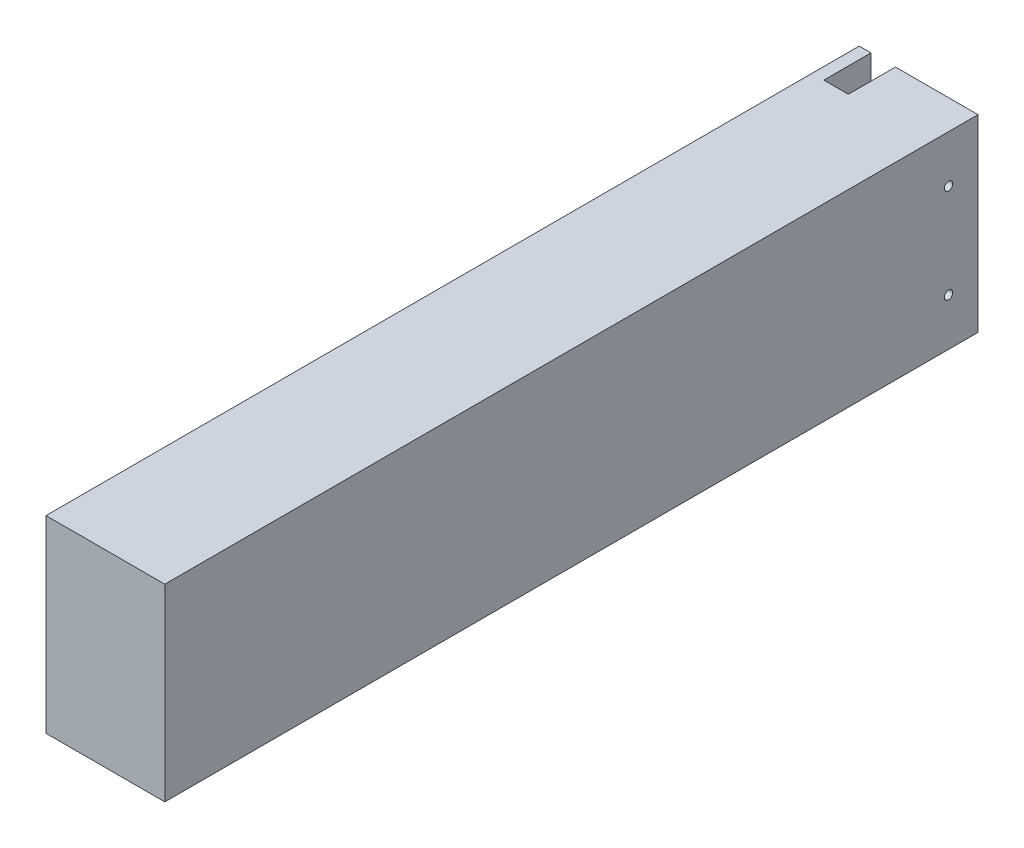
ISO-10303-21;
HEADER;
FILE_DESCRIPTION(('STEP AP214'),'2;1');
FILE_NAME('part.step','',(''),(''),'','','');
FILE_SCHEMA(('AUTOMOTIVE_DESIGN { 1 0 10303 214 1 1 1 1 }'));
ENDSEC;
DATA;
#1=APPLICATION_CONTEXT('core data for automotive mechanical design processes');
#2=APPLICATION_PROTOCOL_DEFINITION('international standard','automotive_design',2000,#1);
#3=PRODUCT_CONTEXT('',#1,'mechanical');
#4=PRODUCT('Part','Part','',(#3));
#5=PRODUCT_RELATED_PRODUCT_CATEGORY('part','',(#4));
#6=PRODUCT_DEFINITION_FORMATION('','',#4);
#7=PRODUCT_DEFINITION_CONTEXT('part definition',#1,'design');
#8=PRODUCT_DEFINITION('design','',#6,#7);
#9=PRODUCT_DEFINITION_SHAPE('','',#8);
#10=(LENGTH_UNIT() NAMED_UNIT(*) SI_UNIT(.MILLI.,.METRE.));
#11=(NAMED_UNIT(*) PLANE_ANGLE_UNIT() SI_UNIT($,.RADIAN.));
#12=(NAMED_UNIT(*) SI_UNIT($,.STERADIAN.) SOLID_ANGLE_UNIT());
#13=UNCERTAINTY_MEASURE_WITH_UNIT(LENGTH_MEASURE(1.E-05),#10,'distance_accuracy_value','');
#14=(GEOMETRIC_REPRESENTATION_CONTEXT(3) GLOBAL_UNCERTAINTY_ASSIGNED_CONTEXT((#13)) GLOBAL_UNIT_ASSIGNED_CONTEXT((#10,
#11,#12)) REPRESENTATION_CONTEXT('',''));
#15=CARTESIAN_POINT('',(0.,0.,0.));
#16=DIRECTION('',(0.,0.,1.));
#17=DIRECTION('',(1.,0.,0.));
#18=AXIS2_PLACEMENT_3D('',#15,#16,#17);
#19=CARTESIAN_POINT('',(12.954,50.8,-15.875));
#20=DIRECTION('',(0.,0.,1.));
#21=DIRECTION('',(1.,0.,0.));
#22=AXIS2_PLACEMENT_3D('',#19,#20,#21);
#23=PLANE('',#22);
#24=DIRECTION('',(-1.,0.,0.));
#25=VECTOR('',#24,1.);
#26=CARTESIAN_POINT('',(12.954,0.,-15.875));
#27=LINE('',#26,#25);
#28=CARTESIAN_POINT('',(32.004,0.,-15.875));
#29=VERTEX_POINT('',#28);
#30=CARTESIAN_POINT('',(9.779,0.,-15.875));
#31=VERTEX_POINT('',#30);
#32=EDGE_CURVE('E118',#29,#31,#27,.T.);
#33=ORIENTED_EDGE('',*,*,#32,.T.);
#34=DIRECTION('',(0.,-1.,0.));
#35=VECTOR('',#34,1.);
#36=CARTESIAN_POINT('',(9.779,50.8,-15.875));
#37=LINE('',#36,#35);
#38=CARTESIAN_POINT('',(9.779,50.8,-15.875));
#39=VERTEX_POINT('',#38);
#40=EDGE_CURVE('E11',#39,#31,#37,.T.);
#41=ORIENTED_EDGE('',*,*,#40,.F.);
#42=DIRECTION('',(-1.,0.,0.));
#43=VECTOR('',#42,1.);
#44=CARTESIAN_POINT('',(12.954,50.8,-15.875));
#45=LINE('',#44,#43);
#46=CARTESIAN_POINT('',(32.004,50.8,-15.875));
#47=VERTEX_POINT('',#46);
#48=EDGE_CURVE('E86',#47,#39,#45,.T.);
#49=ORIENTED_EDGE('',*,*,#48,.F.);
#50=DIRECTION('',(0.,1.,0.));
#51=VECTOR('',#50,1.);
#52=CARTESIAN_POINT('',(32.004,0.,-15.875));
#53=LINE('',#52,#51);
#54=EDGE_CURVE('E160',#29,#47,#53,.T.);
#55=ORIENTED_EDGE('',*,*,#54,.F.);
#56=EDGE_LOOP('',(#33,#41,#49,#55));
#57=FACE_BOUND('',#56,.T.);
#58=ADVANCED_FACE('F35',(#57),#23,.F.);
#59=CARTESIAN_POINT('',(9.779,50.8,-15.875));
#60=DIRECTION('',(1.,0.,0.));
#61=DIRECTION('',(0.,0.,-1.));
#62=AXIS2_PLACEMENT_3D('',#59,#60,#61);
#63=PLANE('',#62);
#64=CARTESIAN_POINT('',(9.779,12.7,-7.9375));
#65=DIRECTION('',(1.,0.,0.));
#66=DIRECTION('',(0.,0.,-1.));
#67=AXIS2_PLACEMENT_3D('',#64,#65,#66);
#68=CIRCLE('',#67,1.1303);
#69=CARTESIAN_POINT('',(9.779,12.7,-9.0678));
#70=VERTEX_POINT('',#69);
#71=EDGE_CURVE('E178',#70,#70,#68,.F.);
#72=ORIENTED_EDGE('',*,*,#71,.F.);
#73=EDGE_LOOP('',(#72));
#74=FACE_BOUND('',#73,.T.);
#75=CARTESIAN_POINT('',(9.779,38.1,-7.9375));
#76=DIRECTION('',(1.,0.,0.));
#77=DIRECTION('',(0.,0.,-1.));
#78=AXIS2_PLACEMENT_3D('',#75,#76,#77);
#79=CIRCLE('',#78,1.1303);
#80=CARTESIAN_POINT('',(9.779,38.1,-9.0678));
#81=VERTEX_POINT('',#80);
#82=EDGE_CURVE('E174',#81,#81,#79,.F.);
#83=ORIENTED_EDGE('',*,*,#82,.F.);
#84=EDGE_LOOP('',(#83));
#85=FACE_BOUND('',#84,.T.);
#86=DIRECTION('',(0.,0.,1.));
#87=VECTOR('',#86,1.);
#88=CARTESIAN_POINT('',(9.779,0.,-15.875));
#89=LINE('',#88,#87);
#90=CARTESIAN_POINT('',(9.779,0.,-3.175));
#91=VERTEX_POINT('',#90);
#92=EDGE_CURVE('E120',#31,#91,#89,.T.);
#93=ORIENTED_EDGE('',*,*,#92,.T.);
#94=DIRECTION('',(0.,-1.,0.));
#95=VECTOR('',#94,1.);
#96=CARTESIAN_POINT('',(9.779,50.8,-3.175));
#97=LINE('',#96,#95);
#98=CARTESIAN_POINT('',(9.779,50.8,-3.175));
#99=VERTEX_POINT('',#98);
#100=EDGE_CURVE('E43',#99,#91,#97,.T.);
#101=ORIENTED_EDGE('',*,*,#100,.F.);
#102=DIRECTION('',(0.,0.,1.));
#103=VECTOR('',#102,1.);
#104=CARTESIAN_POINT('',(9.779,50.8,-15.875));
#105=LINE('',#104,#103);
#106=EDGE_CURVE('E99',#39,#99,#105,.T.);
#107=ORIENTED_EDGE('',*,*,#106,.F.);
#108=ORIENTED_EDGE('',*,*,#40,.T.);
#109=EDGE_LOOP('',(#93,#101,#107,#108));
#110=FACE_BOUND('',#109,.T.);
#111=ADVANCED_FACE('F202',(#74,#85,#110),#63,.F.);
#112=CARTESIAN_POINT('',(9.779,50.8,-3.175));
#113=DIRECTION('',(0.,0.,1.));
#114=DIRECTION('',(1.,0.,0.));
#115=AXIS2_PLACEMENT_3D('',#112,#113,#114);
#116=PLANE('',#115);
#117=DIRECTION('',(-1.,0.,0.));
#118=VECTOR('',#117,1.);
#119=CARTESIAN_POINT('',(9.779,0.,-3.175));
#120=LINE('',#119,#118);
#121=CARTESIAN_POINT('',(3.175,0.,-3.175));
#122=VERTEX_POINT('',#121);
#123=EDGE_CURVE('E107',#91,#122,#120,.T.);
#124=ORIENTED_EDGE('',*,*,#123,.T.);
#125=DIRECTION('',(0.,-1.,0.));
#126=VECTOR('',#125,1.);
#127=CARTESIAN_POINT('',(3.175,50.8,-3.175));
#128=LINE('',#127,#126);
#129=CARTESIAN_POINT('',(3.175,50.8,-3.175));
#130=VERTEX_POINT('',#129);
#131=EDGE_CURVE('E104',#130,#122,#128,.T.);
#132=ORIENTED_EDGE('',*,*,#131,.F.);
#133=DIRECTION('',(-1.,0.,0.));
#134=VECTOR('',#133,1.);
#135=CARTESIAN_POINT('',(9.779,50.8,-3.175));
#136=LINE('',#135,#134);
#137=EDGE_CURVE('E93',#99,#130,#136,.T.);
#138=ORIENTED_EDGE('',*,*,#137,.F.);
#139=ORIENTED_EDGE('',*,*,#100,.T.);
#140=EDGE_LOOP('',(#124,#132,#138,#139));
#141=FACE_BOUND('',#140,.T.);
#142=ADVANCED_FACE('F105',(#141),#116,.F.);
#143=CARTESIAN_POINT('',(3.175,50.8,-15.875));
#144=DIRECTION('',(-1.,0.,0.));
#145=DIRECTION('',(0.,0.,1.));
#146=AXIS2_PLACEMENT_3D('',#143,#144,#145);
#147=PLANE('',#146);
#148=DIRECTION('',(0.,0.,-1.));
#149=VECTOR('',#148,1.);
#150=CARTESIAN_POINT('',(3.175,0.,-15.875));
#151=LINE('',#150,#149);
#152=CARTESIAN_POINT('',(3.175,0.,-15.875));
#153=VERTEX_POINT('',#152);
#154=EDGE_CURVE('E72',#122,#153,#151,.T.);
#155=ORIENTED_EDGE('',*,*,#154,.T.);
#156=DIRECTION('',(0.,-1.,0.));
#157=VECTOR('',#156,1.);
#158=CARTESIAN_POINT('',(3.175,50.8,-15.875));
#159=LINE('',#158,#157);
#160=CARTESIAN_POINT('',(3.175,50.8,-15.875));
#161=VERTEX_POINT('',#160);
#162=EDGE_CURVE('E108',#161,#153,#159,.T.);
#163=ORIENTED_EDGE('',*,*,#162,.F.);
#164=DIRECTION('',(0.,0.,-1.));
#165=VECTOR('',#164,1.);
#166=CARTESIAN_POINT('',(3.175,50.8,-15.875));
#167=LINE('',#166,#165);
#168=EDGE_CURVE('E97',#130,#161,#167,.T.);
#169=ORIENTED_EDGE('',*,*,#168,.F.);
#170=ORIENTED_EDGE('',*,*,#131,.T.);
#171=EDGE_LOOP('',(#155,#163,#169,#170));
#172=FACE_BOUND('',#171,.T.);
#173=ADVANCED_FACE('F110',(#172),#147,.F.);
#174=CARTESIAN_POINT('',(0.,50.8,-15.875));
#175=DIRECTION('',(0.,0.,1.));
#176=DIRECTION('',(1.,0.,0.));
#177=AXIS2_PLACEMENT_3D('',#174,#175,#176);
#178=PLANE('',#177);
#179=DIRECTION('',(-1.,0.,0.));
#180=VECTOR('',#179,1.);
#181=CARTESIAN_POINT('',(0.,0.,-15.875));
#182=LINE('',#181,#180);
#183=CARTESIAN_POINT('',(0.,0.,-15.875));
#184=VERTEX_POINT('',#183);
#185=EDGE_CURVE('E78',#153,#184,#182,.T.);
#186=ORIENTED_EDGE('',*,*,#185,.T.);
#187=DIRECTION('',(0.,-1.,0.));
#188=VECTOR('',#187,1.);
#189=CARTESIAN_POINT('',(0.,50.8,-15.875));
#190=LINE('',#189,#188);
#191=CARTESIAN_POINT('',(0.,50.8,-15.875));
#192=VERTEX_POINT('',#191);
#193=EDGE_CURVE('E117',#192,#184,#190,.T.);
#194=ORIENTED_EDGE('',*,*,#193,.F.);
#195=DIRECTION('',(-1.,0.,0.));
#196=VECTOR('',#195,1.);
#197=CARTESIAN_POINT('',(0.,50.8,-15.875));
#198=LINE('',#197,#196);
#199=EDGE_CURVE('E51',#161,#192,#198,.T.);
#200=ORIENTED_EDGE('',*,*,#199,.F.);
#201=ORIENTED_EDGE('',*,*,#162,.T.);
#202=EDGE_LOOP('',(#186,#194,#200,#201));
#203=FACE_BOUND('',#202,.T.);
#204=ADVANCED_FACE('F216',(#203),#178,.F.);
#205=CARTESIAN_POINT('',(0.,50.8,0.));
#206=DIRECTION('',(1.,0.,0.));
#207=DIRECTION('',(0.,0.,-1.));
#208=AXIS2_PLACEMENT_3D('',#205,#206,#207);
#209=PLANE('',#208);
#210=DIRECTION('',(0.,0.,1.));
#211=VECTOR('',#210,1.);
#212=CARTESIAN_POINT('',(0.,0.,0.));
#213=LINE('',#212,#211);
#214=CARTESIAN_POINT('',(0.,0.,203.2));
#215=VERTEX_POINT('',#214);
#216=EDGE_CURVE('E126',#184,#215,#213,.T.);
#217=ORIENTED_EDGE('',*,*,#216,.T.);
#218=DIRECTION('',(0.,-1.,0.));
#219=VECTOR('',#218,1.);
#220=CARTESIAN_POINT('',(0.,50.8,203.2));
#221=LINE('',#220,#219);
#222=CARTESIAN_POINT('',(0.,50.8,203.2));
#223=VERTEX_POINT('',#222);
#224=EDGE_CURVE('E147',#223,#215,#221,.T.);
#225=ORIENTED_EDGE('',*,*,#224,.F.);
#226=DIRECTION('',(0.,0.,1.));
#227=VECTOR('',#226,1.);
#228=CARTESIAN_POINT('',(0.,50.8,0.));
#229=LINE('',#228,#227);
#230=EDGE_CURVE('E112',#192,#223,#229,.T.);
#231=ORIENTED_EDGE('',*,*,#230,.F.);
#232=ORIENTED_EDGE('',*,*,#193,.T.);
#233=EDGE_LOOP('',(#217,#225,#231,#232));
#234=FACE_BOUND('',#233,.T.);
#235=ADVANCED_FACE('F144',(#234),#209,.F.);
#236=CARTESIAN_POINT('',(0.,50.8,0.));
#237=DIRECTION('',(0.,-1.,0.));
#238=DIRECTION('',(0.,0.,-1.));
#239=AXIS2_PLACEMENT_3D('',#236,#237,#238);
#240=PLANE('',#239);
#241=ORIENTED_EDGE('',*,*,#230,.T.);
#242=DIRECTION('',(-1.,0.,0.));
#243=VECTOR('',#242,1.);
#244=CARTESIAN_POINT('',(32.004,50.8,203.2));
#245=LINE('',#244,#243);
#246=CARTESIAN_POINT('',(32.004,50.8,203.2));
#247=VERTEX_POINT('',#246);
#248=EDGE_CURVE('E170',#247,#223,#245,.T.);
#249=ORIENTED_EDGE('',*,*,#248,.F.);
#250=DIRECTION('',(0.,0.,1.));
#251=VECTOR('',#250,1.);
#252=CARTESIAN_POINT('',(32.004,50.8,-15.875));
#253=LINE('',#252,#251);
#254=EDGE_CURVE('E121',#47,#247,#253,.T.);
#255=ORIENTED_EDGE('',*,*,#254,.F.);
#256=ORIENTED_EDGE('',*,*,#48,.T.);
#257=ORIENTED_EDGE('',*,*,#106,.T.);
#258=ORIENTED_EDGE('',*,*,#137,.T.);
#259=ORIENTED_EDGE('',*,*,#168,.T.);
#260=ORIENTED_EDGE('',*,*,#199,.T.);
#261=EDGE_LOOP('',(#241,#249,#255,#256,#257,#258,#259,#260));
#262=FACE_BOUND('',#261,.T.);
#263=ADVANCED_FACE('F95',(#262),#240,.F.);
#264=CARTESIAN_POINT('',(0.,0.,0.));
#265=DIRECTION('',(0.,-1.,0.));
#266=DIRECTION('',(0.,0.,-1.));
#267=AXIS2_PLACEMENT_3D('',#264,#265,#266);
#268=PLANE('',#267);
#269=DIRECTION('',(0.,0.,-1.));
#270=VECTOR('',#269,1.);
#271=CARTESIAN_POINT('',(32.004,0.,0.));
#272=LINE('',#271,#270);
#273=CARTESIAN_POINT('',(32.004,0.,203.2));
#274=VERTEX_POINT('',#273);
#275=EDGE_CURVE('E166',#274,#29,#272,.T.);
#276=ORIENTED_EDGE('',*,*,#275,.F.);
#277=DIRECTION('',(1.,0.,0.));
#278=VECTOR('',#277,1.);
#279=CARTESIAN_POINT('',(0.,0.,203.2));
#280=LINE('',#279,#278);
#281=EDGE_CURVE('E140',#215,#274,#280,.T.);
#282=ORIENTED_EDGE('',*,*,#281,.F.);
#283=ORIENTED_EDGE('',*,*,#216,.F.);
#284=ORIENTED_EDGE('',*,*,#185,.F.);
#285=ORIENTED_EDGE('',*,*,#154,.F.);
#286=ORIENTED_EDGE('',*,*,#123,.F.);
#287=ORIENTED_EDGE('',*,*,#92,.F.);
#288=ORIENTED_EDGE('',*,*,#32,.F.);
#289=EDGE_LOOP('',(#276,#282,#283,#284,#285,#286,#287,#288));
#290=FACE_BOUND('',#289,.T.);
#291=ADVANCED_FACE('F134',(#290),#268,.T.);
#292=CARTESIAN_POINT('',(32.004,0.,0.));
#293=DIRECTION('',(1.,0.,0.));
#294=DIRECTION('',(0.,0.,-1.));
#295=AXIS2_PLACEMENT_3D('',#292,#293,#294);
#296=PLANE('',#295);
#297=CARTESIAN_POINT('',(32.004,12.7,-7.93750000000001));
#298=DIRECTION('',(1.,0.,0.));
#299=DIRECTION('',(0.,0.,-1.));
#300=AXIS2_PLACEMENT_3D('',#297,#298,#299);
#301=CIRCLE('',#300,1.1303);
#302=CARTESIAN_POINT('',(32.004,12.7,-9.0678));
#303=VERTEX_POINT('',#302);
#304=EDGE_CURVE('E181',#303,#303,#301,.T.);
#305=ORIENTED_EDGE('',*,*,#304,.F.);
#306=EDGE_LOOP('',(#305));
#307=FACE_BOUND('',#306,.T.);
#308=CARTESIAN_POINT('',(32.004,38.1,-7.93750000000001));
#309=DIRECTION('',(1.,0.,0.));
#310=DIRECTION('',(0.,0.,-1.));
#311=AXIS2_PLACEMENT_3D('',#308,#309,#310);
#312=CIRCLE('',#311,1.1303);
#313=CARTESIAN_POINT('',(32.004,38.1,-9.06780000000001));
#314=VERTEX_POINT('',#313);
#315=EDGE_CURVE('E175',#314,#314,#312,.T.);
#316=ORIENTED_EDGE('',*,*,#315,.F.);
#317=EDGE_LOOP('',(#316));
#318=FACE_BOUND('',#317,.T.);
#319=ORIENTED_EDGE('',*,*,#254,.T.);
#320=DIRECTION('',(0.,1.,0.));
#321=VECTOR('',#320,1.);
#322=CARTESIAN_POINT('',(32.004,0.,203.2));
#323=LINE('',#322,#321);
#324=EDGE_CURVE('E187',#274,#247,#323,.T.);
#325=ORIENTED_EDGE('',*,*,#324,.F.);
#326=ORIENTED_EDGE('',*,*,#275,.T.);
#327=ORIENTED_EDGE('',*,*,#54,.T.);
#328=EDGE_LOOP('',(#319,#325,#326,#327));
#329=FACE_BOUND('',#328,.T.);
#330=ADVANCED_FACE('F163',(#307,#318,#329),#296,.T.);
#331=CARTESIAN_POINT('',(32.004,38.1,-7.93750000000001));
#332=DIRECTION('',(1.,0.,0.));
#333=DIRECTION('',(0.,0.,-1.));
#334=AXIS2_PLACEMENT_3D('',#331,#332,#333);
#335=CYLINDRICAL_SURFACE('',#334,1.1303);
#336=ORIENTED_EDGE('',*,*,#82,.T.);
#337=EDGE_LOOP('',(#336));
#338=FACE_BOUND('',#337,.T.);
#339=ORIENTED_EDGE('',*,*,#315,.T.);
#340=EDGE_LOOP('',(#339));
#341=FACE_BOUND('',#340,.T.);
#342=ADVANCED_FACE('F198',(#338,#341),#335,.F.);
#343=CARTESIAN_POINT('',(32.004,12.7,-7.93750000000001));
#344=DIRECTION('',(1.,0.,0.));
#345=DIRECTION('',(0.,0.,-1.));
#346=AXIS2_PLACEMENT_3D('',#343,#344,#345);
#347=CYLINDRICAL_SURFACE('',#346,1.1303);
#348=ORIENTED_EDGE('',*,*,#71,.T.);
#349=EDGE_LOOP('',(#348));
#350=FACE_BOUND('',#349,.T.);
#351=ORIENTED_EDGE('',*,*,#304,.T.);
#352=EDGE_LOOP('',(#351));
#353=FACE_BOUND('',#352,.T.);
#354=ADVANCED_FACE('F193',(#350,#353),#347,.F.);
#355=CARTESIAN_POINT('',(0.,0.,203.2));
#356=DIRECTION('',(0.,0.,1.));
#357=DIRECTION('',(1.,0.,0.));
#358=AXIS2_PLACEMENT_3D('',#355,#356,#357);
#359=PLANE('',#358);
#360=ORIENTED_EDGE('',*,*,#224,.T.);
#361=ORIENTED_EDGE('',*,*,#281,.T.);
#362=ORIENTED_EDGE('',*,*,#324,.T.);
#363=ORIENTED_EDGE('',*,*,#248,.T.);
#364=EDGE_LOOP('',(#360,#361,#362,#363));
#365=FACE_BOUND('',#364,.T.);
#366=ADVANCED_FACE('F191',(#365),#359,.T.);
#367=CLOSED_SHELL('',(#58,#111,#142,#173,#204,#235,#263,#291,#330,#342,#354,#366));
#368=MANIFOLD_SOLID_BREP('B2',#367);
#369=ADVANCED_BREP_SHAPE_REPRESENTATION('',(#18,#368),#14);
#370=SHAPE_DEFINITION_REPRESENTATION(#9,#369);
ENDSEC;
END-ISO-10303-21;
